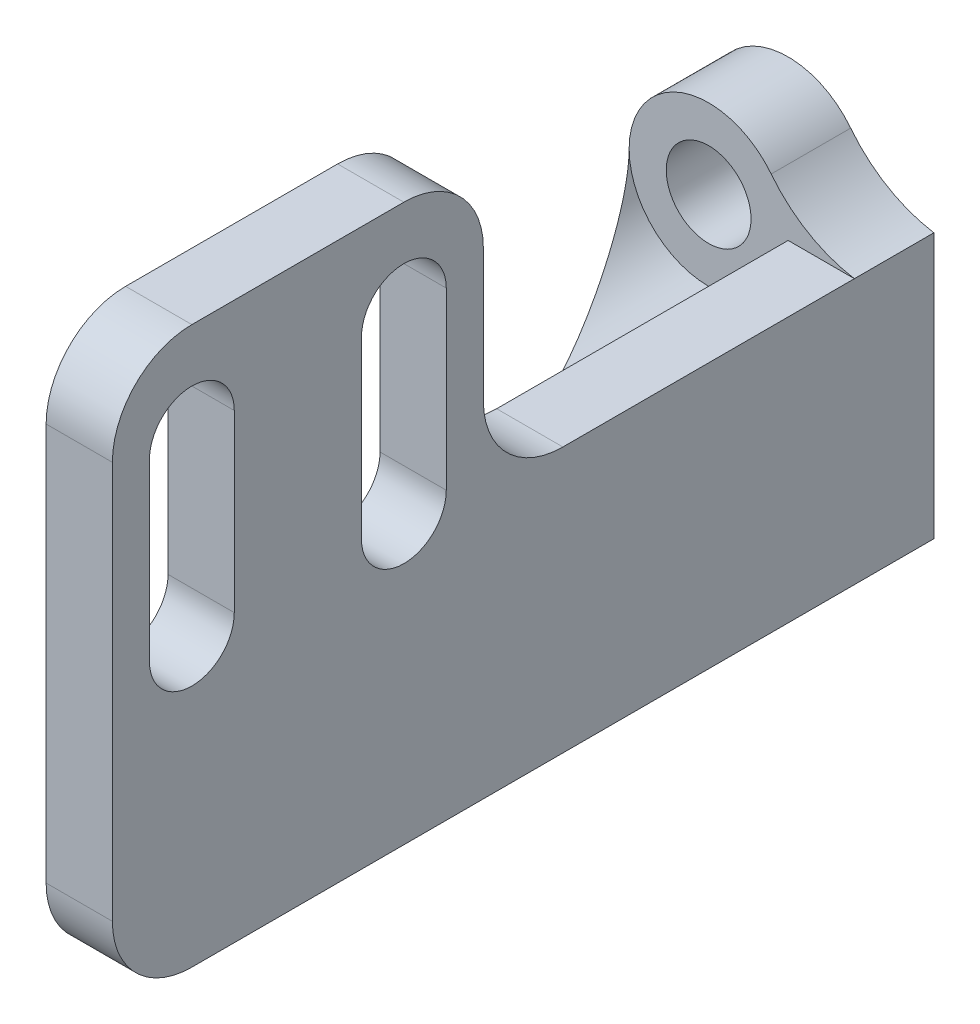
ISO-10303-21;
HEADER;
FILE_DESCRIPTION(('STEP AP214'),'2;1');
FILE_NAME('part.step','',(''),(''),'','','');
FILE_SCHEMA(('AUTOMOTIVE_DESIGN { 1 0 10303 214 1 1 1 1 }'));
ENDSEC;
DATA;
#1=APPLICATION_CONTEXT('core data for automotive mechanical design processes');
#2=APPLICATION_PROTOCOL_DEFINITION('international standard','automotive_design',2000,#1);
#3=PRODUCT_CONTEXT('',#1,'mechanical');
#4=PRODUCT('Part','Part','',(#3));
#5=PRODUCT_RELATED_PRODUCT_CATEGORY('part','',(#4));
#6=PRODUCT_DEFINITION_FORMATION('','',#4);
#7=PRODUCT_DEFINITION_CONTEXT('part definition',#1,'design');
#8=PRODUCT_DEFINITION('design','',#6,#7);
#9=PRODUCT_DEFINITION_SHAPE('','',#8);
#10=(LENGTH_UNIT() NAMED_UNIT(*) SI_UNIT(.MILLI.,.METRE.));
#11=(NAMED_UNIT(*) PLANE_ANGLE_UNIT() SI_UNIT($,.RADIAN.));
#12=(NAMED_UNIT(*) SI_UNIT($,.STERADIAN.) SOLID_ANGLE_UNIT());
#13=UNCERTAINTY_MEASURE_WITH_UNIT(LENGTH_MEASURE(1.E-05),#10,'distance_accuracy_value','');
#14=(GEOMETRIC_REPRESENTATION_CONTEXT(3) GLOBAL_UNCERTAINTY_ASSIGNED_CONTEXT((#13)) GLOBAL_UNIT_ASSIGNED_CONTEXT((#10,
#11,#12)) REPRESENTATION_CONTEXT('',''));
#15=CARTESIAN_POINT('',(0.,0.,0.));
#16=DIRECTION('',(0.,0.,1.));
#17=DIRECTION('',(1.,0.,0.));
#18=AXIS2_PLACEMENT_3D('',#15,#16,#17);
#19=CARTESIAN_POINT('',(3.00000000000005,-33.0103407456897,3.));
#20=DIRECTION('',(0.,1.,0.));
#21=DIRECTION('',(0.,0.,1.));
#22=AXIS2_PLACEMENT_3D('',#19,#20,#21);
#23=PLANE('',#22);
#24=DIRECTION('',(0.,0.,-1.));
#25=VECTOR('',#24,1.);
#26=CARTESIAN_POINT('',(3.00000000000004,-33.0103407456897,31.));
#27=LINE('',#26,#25);
#28=CARTESIAN_POINT('',(3.00000000000004,-33.0103407456897,3.));
#29=VERTEX_POINT('',#28);
#30=CARTESIAN_POINT('',(3.00000000000004,-33.0103407456897,14.));
#31=VERTEX_POINT('',#30);
#32=EDGE_CURVE('E236',#29,#31,#27,.F.);
#33=ORIENTED_EDGE('',*,*,#32,.T.);
#34=DIRECTION('',(1.,0.,0.));
#35=VECTOR('',#34,1.);
#36=CARTESIAN_POINT('',(5.50000000000005,-33.0103407456897,14.));
#37=LINE('',#36,#35);
#38=CARTESIAN_POINT('',(5.50000000000005,-33.0103407456897,14.));
#39=VERTEX_POINT('',#38);
#40=EDGE_CURVE('E307',#31,#39,#37,.T.);
#41=ORIENTED_EDGE('',*,*,#40,.T.);
#42=DIRECTION('',(0.,0.,-1.));
#43=VECTOR('',#42,1.);
#44=CARTESIAN_POINT('',(5.50000000000005,-33.0103407456897,3.));
#45=LINE('',#44,#43);
#46=CARTESIAN_POINT('',(5.50000000000005,-33.0103407456897,3.));
#47=VERTEX_POINT('',#46);
#48=EDGE_CURVE('E261',#39,#47,#45,.T.);
#49=ORIENTED_EDGE('',*,*,#48,.T.);
#50=DIRECTION('',(-1.,0.,0.));
#51=VECTOR('',#50,1.);
#52=CARTESIAN_POINT('',(0.,-33.0103407456897,3.));
#53=LINE('',#52,#51);
#54=EDGE_CURVE('E254',#47,#29,#53,.T.);
#55=ORIENTED_EDGE('',*,*,#54,.T.);
#56=EDGE_LOOP('',(#33,#41,#49,#55));
#57=FACE_BOUND('',#56,.T.);
#58=ADVANCED_FACE('F65',(#57),#23,.T.);
#59=CARTESIAN_POINT('',(5.50000000000005,-43.0103407456897,3.));
#60=DIRECTION('',(0.,-1.,0.));
#61=DIRECTION('',(0.,0.,-1.));
#62=AXIS2_PLACEMENT_3D('',#59,#60,#61);
#63=PLANE('',#62);
#64=DIRECTION('',(0.,0.,-1.));
#65=VECTOR('',#64,1.);
#66=CARTESIAN_POINT('',(5.50000000000005,-43.0103407456897,3.));
#67=LINE('',#66,#65);
#68=CARTESIAN_POINT('',(5.50000000000005,-43.0103407456897,28.));
#69=VERTEX_POINT('',#68);
#70=CARTESIAN_POINT('',(5.50000000000005,-43.0103407456897,3.));
#71=VERTEX_POINT('',#70);
#72=EDGE_CURVE('E395',#69,#71,#67,.T.);
#73=ORIENTED_EDGE('',*,*,#72,.F.);
#74=DIRECTION('',(1.,0.,0.));
#75=VECTOR('',#74,1.);
#76=CARTESIAN_POINT('',(5.50000000000005,-43.0103407456897,28.));
#77=LINE('',#76,#75);
#78=CARTESIAN_POINT('',(3.00000000000005,-43.0103407456897,28.));
#79=VERTEX_POINT('',#78);
#80=EDGE_CURVE('E300',#69,#79,#77,.F.);
#81=ORIENTED_EDGE('',*,*,#80,.T.);
#82=DIRECTION('',(0.,0.,-1.));
#83=VECTOR('',#82,1.);
#84=CARTESIAN_POINT('',(3.00000000000005,-43.0103407456897,31.));
#85=LINE('',#84,#83);
#86=CARTESIAN_POINT('',(3.00000000000005,-43.0103407456897,14.));
#87=VERTEX_POINT('',#86);
#88=EDGE_CURVE('E353',#79,#87,#85,.T.);
#89=ORIENTED_EDGE('',*,*,#88,.T.);
#90=DIRECTION('',(0.,0.,-1.));
#91=VECTOR('',#90,1.);
#92=CARTESIAN_POINT('',(3.00000000000005,-43.0103407456897,31.));
#93=LINE('',#92,#91);
#94=CARTESIAN_POINT('',(3.00000000000005,-43.0103407456897,3.));
#95=VERTEX_POINT('',#94);
#96=EDGE_CURVE('E246',#87,#95,#93,.T.);
#97=ORIENTED_EDGE('',*,*,#96,.T.);
#98=DIRECTION('',(1.,0.,0.));
#99=VECTOR('',#98,1.);
#100=CARTESIAN_POINT('',(0.,-43.0103407456897,3.));
#101=LINE('',#100,#99);
#102=EDGE_CURVE('E389',#95,#71,#101,.T.);
#103=ORIENTED_EDGE('',*,*,#102,.T.);
#104=EDGE_LOOP('',(#73,#81,#89,#97,#103));
#105=FACE_BOUND('',#104,.T.);
#106=ADVANCED_FACE('F451',(#105),#63,.T.);
#107=CARTESIAN_POINT('',(3.00000000000005,-20.480376659548,14.));
#108=DIRECTION('',(-0.877895572914384,0.,0.478852130680573));
#109=DIRECTION('',(0.478852130680573,0.,0.877895572914384));
#110=AXIS2_PLACEMENT_3D('',#107,#108,#109);
#111=PLANE('',#110);
#112=DIRECTION('',(0.,-1.,0.));
#113=VECTOR('',#112,1.);
#114=CARTESIAN_POINT('',(-2.99999999999995,0.,3.));
#115=LINE('',#114,#113);
#116=CARTESIAN_POINT('',(-2.99999999999995,-33.0103407456897,3.));
#117=VERTEX_POINT('',#116);
#118=CARTESIAN_POINT('',(-2.99999999999995,-43.0103407456897,3.));
#119=VERTEX_POINT('',#118);
#120=EDGE_CURVE('E356',#117,#119,#115,.T.);
#121=ORIENTED_EDGE('',*,*,#120,.T.);
#122=CARTESIAN_POINT('',(0.,-43.0103407456897,8.5));
#123=DIRECTION('',(-0.877895572914384,0.,0.478852130680573));
#124=DIRECTION('',(-0.478852130680573,0.,-0.877895572914384));
#125=AXIS2_PLACEMENT_3D('',#122,#123,#124);
#126=ELLIPSE('',#125,6.26498204307084,3.);
#127=EDGE_CURVE('E291',#119,#87,#126,.F.);
#128=ORIENTED_EDGE('',*,*,#127,.T.);
#129=DIRECTION('',(0.,-1.,0.));
#130=VECTOR('',#129,1.);
#131=CARTESIAN_POINT('',(3.00000000000005,-20.480376659548,14.));
#132=LINE('',#131,#130);
#133=EDGE_CURVE('E339',#31,#87,#132,.T.);
#134=ORIENTED_EDGE('',*,*,#133,.F.);
#135=CARTESIAN_POINT('',(0.,-33.0103407456897,8.5));
#136=DIRECTION('',(-0.877895572914384,0.,0.478852130680573));
#137=DIRECTION('',(-0.478852130680573,0.,-0.877895572914384));
#138=AXIS2_PLACEMENT_3D('',#135,#136,#137);
#139=ELLIPSE('',#138,6.26498204307082,2.99999999999999);
#140=EDGE_CURVE('E241',#31,#117,#139,.F.);
#141=ORIENTED_EDGE('',*,*,#140,.T.);
#142=EDGE_LOOP('',(#121,#128,#134,#141));
#143=FACE_BOUND('',#142,.T.);
#144=ADVANCED_FACE('F435',(#143),#111,.T.);
#145=CARTESIAN_POINT('',(0.,0.,3.));
#146=DIRECTION('',(0.,0.,1.));
#147=DIRECTION('',(1.,0.,0.));
#148=AXIS2_PLACEMENT_3D('',#145,#146,#147);
#149=PLANE('',#148);
#150=CARTESIAN_POINT('',(0.,-43.0103407456897,3.));
#151=DIRECTION('',(0.,0.,1.));
#152=DIRECTION('',(1.,0.,0.));
#153=AXIS2_PLACEMENT_3D('',#150,#151,#152);
#154=CIRCLE('',#153,3.);
#155=CARTESIAN_POINT('',(2.3607954545455,-44.8614606288408,3.));
#156=VERTEX_POINT('',#155);
#157=EDGE_CURVE('E359',#119,#156,#154,.T.);
#158=ORIENTED_EDGE('',*,*,#157,.T.);
#159=CARTESIAN_POINT('',(6.29545454545459,-47.9466604340928,3.));
#160=DIRECTION('',(0.,0.,1.));
#161=DIRECTION('',(1.,0.,0.));
#162=AXIS2_PLACEMENT_3D('',#159,#160,#161);
#163=CIRCLE('',#162,5.);
#164=EDGE_CURVE('E268',#156,#71,#163,.F.);
#165=ORIENTED_EDGE('',*,*,#164,.T.);
#166=ORIENTED_EDGE('',*,*,#102,.F.);
#167=CARTESIAN_POINT('',(0.,-43.0103407456897,3.));
#168=DIRECTION('',(0.,0.,1.));
#169=DIRECTION('',(1.,0.,0.));
#170=AXIS2_PLACEMENT_3D('',#167,#168,#169);
#171=CIRCLE('',#170,3.);
#172=EDGE_CURVE('E247',#95,#119,#171,.T.);
#173=ORIENTED_EDGE('',*,*,#172,.T.);
#174=EDGE_LOOP('',(#158,#165,#166,#173));
#175=FACE_BOUND('',#174,.T.);
#176=CARTESIAN_POINT('',(0.,-43.0103407456897,3.));
#177=DIRECTION('',(0.,0.,1.));
#178=DIRECTION('',(1.,0.,0.));
#179=AXIS2_PLACEMENT_3D('',#176,#177,#178);
#180=CIRCLE('',#179,1.6);
#181=CARTESIAN_POINT('',(1.60000000000005,-43.0103407456897,3.));
#182=VERTEX_POINT('',#181);
#183=EDGE_CURVE('E367',#182,#182,#180,.T.);
#184=ORIENTED_EDGE('',*,*,#183,.F.);
#185=EDGE_LOOP('',(#184));
#186=FACE_BOUND('',#185,.T.);
#187=ADVANCED_FACE('F407',(#175,#186),#149,.T.);
#188=CARTESIAN_POINT('',(0.,-43.0103407456897,3.));
#189=DIRECTION('',(0.,0.,-1.));
#190=DIRECTION('',(-1.,0.,0.));
#191=AXIS2_PLACEMENT_3D('',#188,#189,#190);
#192=CYLINDRICAL_SURFACE('',#191,1.6);
#193=ORIENTED_EDGE('',*,*,#183,.T.);
#194=EDGE_LOOP('',(#193));
#195=FACE_BOUND('',#194,.T.);
#196=CARTESIAN_POINT('',(0.,-43.0103407456897,0.));
#197=DIRECTION('',(0.,0.,1.));
#198=DIRECTION('',(1.,0.,0.));
#199=AXIS2_PLACEMENT_3D('',#196,#197,#198);
#200=CIRCLE('',#199,1.6);
#201=CARTESIAN_POINT('',(1.60000000000005,-43.0103407456897,0.));
#202=VERTEX_POINT('',#201);
#203=EDGE_CURVE('E360',#202,#202,#200,.T.);
#204=ORIENTED_EDGE('',*,*,#203,.F.);
#205=EDGE_LOOP('',(#204));
#206=FACE_BOUND('',#205,.T.);
#207=ADVANCED_FACE('F446',(#195,#206),#192,.F.);
#208=CARTESIAN_POINT('',(0.,-33.0103407456897,3.));
#209=DIRECTION('',(0.,0.,-1.));
#210=DIRECTION('',(-1.,0.,0.));
#211=AXIS2_PLACEMENT_3D('',#208,#209,#210);
#212=CYLINDRICAL_SURFACE('',#211,1.6);
#213=CARTESIAN_POINT('',(0.,-33.0103407456897,3.));
#214=DIRECTION('',(0.,0.,1.));
#215=DIRECTION('',(1.,0.,0.));
#216=AXIS2_PLACEMENT_3D('',#213,#214,#215);
#217=CIRCLE('',#216,1.6);
#218=CARTESIAN_POINT('',(1.60000000000005,-33.0103407456897,3.));
#219=VERTEX_POINT('',#218);
#220=EDGE_CURVE('E364',#219,#219,#217,.T.);
#221=ORIENTED_EDGE('',*,*,#220,.T.);
#222=EDGE_LOOP('',(#221));
#223=FACE_BOUND('',#222,.T.);
#224=CARTESIAN_POINT('',(0.,-33.0103407456897,0.));
#225=DIRECTION('',(0.,0.,1.));
#226=DIRECTION('',(1.,0.,0.));
#227=AXIS2_PLACEMENT_3D('',#224,#225,#226);
#228=CIRCLE('',#227,1.6);
#229=CARTESIAN_POINT('',(1.60000000000005,-33.0103407456897,0.));
#230=VERTEX_POINT('',#229);
#231=EDGE_CURVE('E379',#230,#230,#228,.T.);
#232=ORIENTED_EDGE('',*,*,#231,.F.);
#233=EDGE_LOOP('',(#232));
#234=FACE_BOUND('',#233,.T.);
#235=ADVANCED_FACE('F439',(#223,#234),#212,.F.);
#236=CARTESIAN_POINT('',(0.,-43.0103407456897,3.));
#237=DIRECTION('',(0.,0.,-1.));
#238=DIRECTION('',(-1.,0.,0.));
#239=AXIS2_PLACEMENT_3D('',#236,#237,#238);
#240=CYLINDRICAL_SURFACE('',#239,3.);
#241=CARTESIAN_POINT('',(0.,-43.0103407456897,0.));
#242=DIRECTION('',(0.,0.,1.));
#243=DIRECTION('',(1.,0.,0.));
#244=AXIS2_PLACEMENT_3D('',#241,#242,#243);
#245=CIRCLE('',#244,3.);
#246=CARTESIAN_POINT('',(-2.99999999999995,-43.0103407456897,0.));
#247=VERTEX_POINT('',#246);
#248=CARTESIAN_POINT('',(2.3607954545455,-44.8614606288408,0.));
#249=VERTEX_POINT('',#248);
#250=EDGE_CURVE('E374',#247,#249,#245,.T.);
#251=ORIENTED_EDGE('',*,*,#250,.T.);
#252=DIRECTION('',(0.,0.,-1.));
#253=VECTOR('',#252,1.);
#254=CARTESIAN_POINT('',(2.3607954545455,-44.8614606288408,3.));
#255=LINE('',#254,#253);
#256=EDGE_CURVE('E399',#249,#156,#255,.F.);
#257=ORIENTED_EDGE('',*,*,#256,.T.);
#258=ORIENTED_EDGE('',*,*,#157,.F.);
#259=DIRECTION('',(0.,0.,-1.));
#260=VECTOR('',#259,1.);
#261=CARTESIAN_POINT('',(-2.99999999999995,-43.0103407456897,3.));
#262=LINE('',#261,#260);
#263=EDGE_CURVE('E386',#119,#247,#262,.T.);
#264=ORIENTED_EDGE('',*,*,#263,.T.);
#265=EDGE_LOOP('',(#251,#257,#258,#264));
#266=FACE_BOUND('',#265,.T.);
#267=ADVANCED_FACE('F437',(#266),#240,.T.);
#268=CARTESIAN_POINT('',(0.,-33.0103407456897,3.));
#269=DIRECTION('',(0.,0.,-1.));
#270=DIRECTION('',(-1.,0.,0.));
#271=AXIS2_PLACEMENT_3D('',#268,#269,#270);
#272=CYLINDRICAL_SURFACE('',#271,3.);
#273=CARTESIAN_POINT('',(0.,-33.0103407456897,3.));
#274=DIRECTION('',(0.,0.,1.));
#275=DIRECTION('',(1.,0.,0.));
#276=AXIS2_PLACEMENT_3D('',#273,#274,#275);
#277=CIRCLE('',#276,3.);
#278=CARTESIAN_POINT('',(2.3607954545455,-31.1592208625386,3.));
#279=VERTEX_POINT('',#278);
#280=EDGE_CURVE('E257',#279,#117,#277,.T.);
#281=ORIENTED_EDGE('',*,*,#280,.F.);
#282=DIRECTION('',(0.,0.,-1.));
#283=VECTOR('',#282,1.);
#284=CARTESIAN_POINT('',(2.3607954545455,-31.1592208625386,3.));
#285=LINE('',#284,#283);
#286=CARTESIAN_POINT('',(2.3607954545455,-31.1592208625386,0.));
#287=VERTEX_POINT('',#286);
#288=EDGE_CURVE('E263',#279,#287,#285,.T.);
#289=ORIENTED_EDGE('',*,*,#288,.T.);
#290=CARTESIAN_POINT('',(0.,-33.0103407456897,0.));
#291=DIRECTION('',(0.,0.,1.));
#292=DIRECTION('',(1.,0.,0.));
#293=AXIS2_PLACEMENT_3D('',#290,#291,#292);
#294=CIRCLE('',#293,3.);
#295=CARTESIAN_POINT('',(-2.99999999999995,-33.0103407456897,0.));
#296=VERTEX_POINT('',#295);
#297=EDGE_CURVE('E377',#287,#296,#294,.T.);
#298=ORIENTED_EDGE('',*,*,#297,.T.);
#299=DIRECTION('',(0.,0.,-1.));
#300=VECTOR('',#299,1.);
#301=CARTESIAN_POINT('',(-2.99999999999995,-33.0103407456897,3.));
#302=LINE('',#301,#300);
#303=EDGE_CURVE('E370',#117,#296,#302,.T.);
#304=ORIENTED_EDGE('',*,*,#303,.F.);
#305=EDGE_LOOP('',(#281,#289,#298,#304));
#306=FACE_BOUND('',#305,.T.);
#307=ADVANCED_FACE('F428',(#306),#272,.T.);
#308=CARTESIAN_POINT('',(-2.99999999999995,0.,3.));
#309=DIRECTION('',(1.,0.,0.));
#310=DIRECTION('',(0.,0.,-1.));
#311=AXIS2_PLACEMENT_3D('',#308,#309,#310);
#312=PLANE('',#311);
#313=DIRECTION('',(0.,-1.,0.));
#314=VECTOR('',#313,1.);
#315=CARTESIAN_POINT('',(-2.99999999999995,0.,0.));
#316=LINE('',#315,#314);
#317=EDGE_CURVE('E371',#296,#247,#316,.T.);
#318=ORIENTED_EDGE('',*,*,#317,.T.);
#319=ORIENTED_EDGE('',*,*,#263,.F.);
#320=ORIENTED_EDGE('',*,*,#120,.F.);
#321=ORIENTED_EDGE('',*,*,#303,.T.);
#322=EDGE_LOOP('',(#318,#319,#320,#321));
#323=FACE_BOUND('',#322,.T.);
#324=ADVANCED_FACE('F432',(#323),#312,.F.);
#325=CARTESIAN_POINT('',(0.,0.,0.));
#326=DIRECTION('',(0.,0.,1.));
#327=DIRECTION('',(1.,0.,0.));
#328=AXIS2_PLACEMENT_3D('',#325,#326,#327);
#329=PLANE('',#328);
#330=ORIENTED_EDGE('',*,*,#317,.F.);
#331=ORIENTED_EDGE('',*,*,#297,.F.);
#332=CARTESIAN_POINT('',(6.29545454545459,-28.0740210572866,0.));
#333=DIRECTION('',(0.,0.,1.));
#334=DIRECTION('',(1.,0.,0.));
#335=AXIS2_PLACEMENT_3D('',#332,#333,#334);
#336=CIRCLE('',#335,5.);
#337=CARTESIAN_POINT('',(5.50000000000005,-33.0103407456897,0.));
#338=VERTEX_POINT('',#337);
#339=EDGE_CURVE('E262',#287,#338,#336,.T.);
#340=ORIENTED_EDGE('',*,*,#339,.T.);
#341=DIRECTION('',(0.,-1.,0.));
#342=VECTOR('',#341,1.);
#343=CARTESIAN_POINT('',(5.50000000000005,-33.0103407456897,0.));
#344=LINE('',#343,#342);
#345=CARTESIAN_POINT('',(5.50000000000005,-43.0103407456897,0.));
#346=VERTEX_POINT('',#345);
#347=EDGE_CURVE('E355',#338,#346,#344,.T.);
#348=ORIENTED_EDGE('',*,*,#347,.T.);
#349=CARTESIAN_POINT('',(6.29545454545459,-47.9466604340928,0.));
#350=DIRECTION('',(0.,0.,1.));
#351=DIRECTION('',(1.,0.,0.));
#352=AXIS2_PLACEMENT_3D('',#349,#350,#351);
#353=CIRCLE('',#352,5.);
#354=EDGE_CURVE('E401',#346,#249,#353,.T.);
#355=ORIENTED_EDGE('',*,*,#354,.T.);
#356=ORIENTED_EDGE('',*,*,#250,.F.);
#357=EDGE_LOOP('',(#330,#331,#340,#348,#355,#356));
#358=FACE_BOUND('',#357,.T.);
#359=ORIENTED_EDGE('',*,*,#231,.T.);
#360=EDGE_LOOP('',(#359));
#361=FACE_BOUND('',#360,.T.);
#362=ORIENTED_EDGE('',*,*,#203,.T.);
#363=EDGE_LOOP('',(#362));
#364=FACE_BOUND('',#363,.T.);
#365=ADVANCED_FACE('F420',(#358,#361,#364),#329,.F.);
#366=CARTESIAN_POINT('',(6.29545454545459,-28.0740210572866,3.));
#367=DIRECTION('',(0.,0.,1.));
#368=DIRECTION('',(1.,0.,0.));
#369=AXIS2_PLACEMENT_3D('',#366,#367,#368);
#370=CIRCLE('',#369,5.);
#371=EDGE_CURVE('E265',#47,#279,#370,.F.);
#372=ORIENTED_EDGE('',*,*,#371,.T.);
#373=ORIENTED_EDGE('',*,*,#280,.T.);
#374=CARTESIAN_POINT('',(0.,-33.0103407456897,3.));
#375=DIRECTION('',(0.,0.,1.));
#376=DIRECTION('',(1.,0.,0.));
#377=AXIS2_PLACEMENT_3D('',#374,#375,#376);
#378=CIRCLE('',#377,2.99999999999999);
#379=EDGE_CURVE('E239',#117,#29,#378,.T.);
#380=ORIENTED_EDGE('',*,*,#379,.T.);
#381=ORIENTED_EDGE('',*,*,#54,.F.);
#382=EDGE_LOOP('',(#372,#373,#380,#381));
#383=FACE_BOUND('',#382,.T.);
#384=ORIENTED_EDGE('',*,*,#220,.F.);
#385=EDGE_LOOP('',(#384));
#386=FACE_BOUND('',#385,.T.);
#387=ADVANCED_FACE('F252',(#383,#386),#149,.T.);
#388=CARTESIAN_POINT('',(5.50000000000005,-33.0103407456897,3.));
#389=DIRECTION('',(1.,0.,0.));
#390=DIRECTION('',(0.,0.,-1.));
#391=AXIS2_PLACEMENT_3D('',#388,#389,#390);
#392=PLANE('',#391);
#393=CARTESIAN_POINT('',(5.50000000000005,-25.6179185229941,28.));
#394=DIRECTION('',(1.,0.,0.));
#395=DIRECTION('',(0.,0.,-1.));
#396=AXIS2_PLACEMENT_3D('',#393,#394,#395);
#397=CIRCLE('',#396,1.6);
#398=CARTESIAN_POINT('',(5.50000000000005,-25.6179185229941,26.4));
#399=VERTEX_POINT('',#398);
#400=CARTESIAN_POINT('',(5.50000000000005,-25.6179185229941,29.6));
#401=VERTEX_POINT('',#400);
#402=EDGE_CURVE('E496',#399,#401,#397,.T.);
#403=ORIENTED_EDGE('',*,*,#402,.F.);
#404=DIRECTION('',(0.,1.,0.));
#405=VECTOR('',#404,1.);
#406=CARTESIAN_POINT('',(5.50000000000005,-25.6179185229941,26.4));
#407=LINE('',#406,#405);
#408=CARTESIAN_POINT('',(5.50000000000005,-32.2232424042106,26.4));
#409=VERTEX_POINT('',#408);
#410=EDGE_CURVE('E505',#409,#399,#407,.T.);
#411=ORIENTED_EDGE('',*,*,#410,.F.);
#412=CARTESIAN_POINT('',(5.50000000000005,-32.2232424042106,28.));
#413=DIRECTION('',(1.,0.,0.));
#414=DIRECTION('',(0.,0.,-1.));
#415=AXIS2_PLACEMENT_3D('',#412,#413,#414);
#416=CIRCLE('',#415,1.59999999999999);
#417=CARTESIAN_POINT('',(5.50000000000005,-32.2232424042106,29.6));
#418=VERTEX_POINT('',#417);
#419=EDGE_CURVE('E502',#418,#409,#416,.T.);
#420=ORIENTED_EDGE('',*,*,#419,.F.);
#421=DIRECTION('',(0.,-1.,0.));
#422=VECTOR('',#421,1.);
#423=CARTESIAN_POINT('',(5.50000000000005,-25.6179185229941,29.6));
#424=LINE('',#423,#422);
#425=EDGE_CURVE('E498',#401,#418,#424,.T.);
#426=ORIENTED_EDGE('',*,*,#425,.F.);
#427=EDGE_LOOP('',(#403,#411,#420,#426));
#428=FACE_BOUND('',#427,.T.);
#429=CARTESIAN_POINT('',(5.50000000000005,-25.6179185229941,20.));
#430=DIRECTION('',(1.,0.,0.));
#431=DIRECTION('',(0.,0.,1.));
#432=AXIS2_PLACEMENT_3D('',#429,#430,#431);
#433=CIRCLE('',#432,1.6);
#434=CARTESIAN_POINT('',(5.50000000000005,-25.6179185229941,18.4));
#435=VERTEX_POINT('',#434);
#436=CARTESIAN_POINT('',(5.50000000000005,-25.6179185229941,21.6));
#437=VERTEX_POINT('',#436);
#438=EDGE_CURVE('E499',#435,#437,#433,.T.);
#439=ORIENTED_EDGE('',*,*,#438,.F.);
#440=DIRECTION('',(0.,1.,0.));
#441=VECTOR('',#440,1.);
#442=CARTESIAN_POINT('',(5.50000000000005,-25.6179185229941,18.4));
#443=LINE('',#442,#441);
#444=CARTESIAN_POINT('',(5.50000000000005,-32.2232424042106,18.4));
#445=VERTEX_POINT('',#444);
#446=EDGE_CURVE('E519',#445,#435,#443,.T.);
#447=ORIENTED_EDGE('',*,*,#446,.F.);
#448=CARTESIAN_POINT('',(5.50000000000005,-32.2232424042106,20.));
#449=DIRECTION('',(1.,0.,0.));
#450=DIRECTION('',(0.,0.,1.));
#451=AXIS2_PLACEMENT_3D('',#448,#449,#450);
#452=CIRCLE('',#451,1.59999999999999);
#453=CARTESIAN_POINT('',(5.50000000000005,-32.2232424042106,21.6));
#454=VERTEX_POINT('',#453);
#455=EDGE_CURVE('E527',#454,#445,#452,.T.);
#456=ORIENTED_EDGE('',*,*,#455,.F.);
#457=DIRECTION('',(0.,-1.,0.));
#458=VECTOR('',#457,1.);
#459=CARTESIAN_POINT('',(5.50000000000005,-25.6179185229941,21.6));
#460=LINE('',#459,#458);
#461=EDGE_CURVE('E530',#437,#454,#460,.T.);
#462=ORIENTED_EDGE('',*,*,#461,.F.);
#463=EDGE_LOOP('',(#439,#447,#456,#462));
#464=FACE_BOUND('',#463,.T.);
#465=DIRECTION('',(0.,1.,0.));
#466=VECTOR('',#465,1.);
#467=CARTESIAN_POINT('',(5.50000000000005,-43.0103407456897,31.));
#468=LINE('',#467,#466);
#469=CARTESIAN_POINT('',(5.50000000000005,-40.0103407456897,31.));
#470=VERTEX_POINT('',#469);
#471=CARTESIAN_POINT('',(5.50000000000005,-25.0103407456897,31.));
#472=VERTEX_POINT('',#471);
#473=EDGE_CURVE('E346',#470,#472,#468,.T.);
#474=ORIENTED_EDGE('',*,*,#473,.F.);
#475=CARTESIAN_POINT('',(5.50000000000005,-40.0103407456897,28.));
#476=DIRECTION('',(1.,0.,0.));
#477=DIRECTION('',(0.,0.,-1.));
#478=AXIS2_PLACEMENT_3D('',#475,#476,#477);
#479=CIRCLE('',#478,3.);
#480=EDGE_CURVE('E298',#470,#69,#479,.T.);
#481=ORIENTED_EDGE('',*,*,#480,.T.);
#482=ORIENTED_EDGE('',*,*,#72,.T.);
#483=EDGE_CURVE('E392',#71,#346,#67,.T.);
#484=ORIENTED_EDGE('',*,*,#483,.T.);
#485=ORIENTED_EDGE('',*,*,#347,.F.);
#486=EDGE_CURVE('E394',#47,#338,#45,.T.);
#487=ORIENTED_EDGE('',*,*,#486,.F.);
#488=ORIENTED_EDGE('',*,*,#48,.F.);
#489=CARTESIAN_POINT('',(5.50000000000005,-30.0103407456897,14.));
#490=DIRECTION('',(1.,0.,0.));
#491=DIRECTION('',(0.,0.,-1.));
#492=AXIS2_PLACEMENT_3D('',#489,#490,#491);
#493=CIRCLE('',#492,3.);
#494=CARTESIAN_POINT('',(5.50000000000005,-30.0103407456897,17.));
#495=VERTEX_POINT('',#494);
#496=EDGE_CURVE('E73',#39,#495,#493,.F.);
#497=ORIENTED_EDGE('',*,*,#496,.T.);
#498=DIRECTION('',(0.,1.,0.));
#499=VECTOR('',#498,1.);
#500=CARTESIAN_POINT('',(5.50000000000005,-22.0103407456897,17.));
#501=LINE('',#500,#499);
#502=CARTESIAN_POINT('',(5.50000000000005,-25.0103407456897,17.));
#503=VERTEX_POINT('',#502);
#504=EDGE_CURVE('E322',#495,#503,#501,.T.);
#505=ORIENTED_EDGE('',*,*,#504,.T.);
#506=CARTESIAN_POINT('',(5.50000000000005,-25.0103407456897,20.));
#507=DIRECTION('',(1.,0.,0.));
#508=DIRECTION('',(0.,0.,-1.));
#509=AXIS2_PLACEMENT_3D('',#506,#507,#508);
#510=CIRCLE('',#509,3.);
#511=CARTESIAN_POINT('',(5.50000000000005,-22.0103407456897,20.));
#512=VERTEX_POINT('',#511);
#513=EDGE_CURVE('E294',#503,#512,#510,.T.);
#514=ORIENTED_EDGE('',*,*,#513,.T.);
#515=DIRECTION('',(0.,0.,1.));
#516=VECTOR('',#515,1.);
#517=CARTESIAN_POINT('',(5.50000000000005,-22.0103407456897,31.));
#518=LINE('',#517,#516);
#519=CARTESIAN_POINT('',(5.50000000000005,-22.0103407456897,28.));
#520=VERTEX_POINT('',#519);
#521=EDGE_CURVE('E331',#512,#520,#518,.T.);
#522=ORIENTED_EDGE('',*,*,#521,.T.);
#523=CARTESIAN_POINT('',(5.50000000000005,-25.0103407456897,28.));
#524=DIRECTION('',(1.,0.,0.));
#525=DIRECTION('',(0.,0.,-1.));
#526=AXIS2_PLACEMENT_3D('',#523,#524,#525);
#527=CIRCLE('',#526,3.);
#528=EDGE_CURVE('E296',#520,#472,#527,.T.);
#529=ORIENTED_EDGE('',*,*,#528,.T.);
#530=EDGE_LOOP('',(#474,#481,#482,#484,#485,#487,#488,#497,#505,#514,#522,#529));
#531=FACE_BOUND('',#530,.T.);
#532=ADVANCED_FACE('F321',(#428,#464,#531),#392,.T.);
#533=CARTESIAN_POINT('',(3.00000000000005,-33.0103407456897,31.));
#534=DIRECTION('',(1.,0.,0.));
#535=DIRECTION('',(0.,0.,-1.));
#536=AXIS2_PLACEMENT_3D('',#533,#534,#535);
#537=PLANE('',#536);
#538=CARTESIAN_POINT('',(3.00000000000005,-33.0103407456897,21.3930097633688));
#539=CARTESIAN_POINT('',(3.00000000000005,-33.1951352528028,21.2885945224365));
#540=CARTESIAN_POINT('',(3.00000000000005,-33.3467062679307,21.1392229575088));
#541=CARTESIAN_POINT('',(3.00000000000005,-33.497692865432,20.9904273297111));
#542=CARTESIAN_POINT('',(3.00000000000005,-33.605153643467,20.8064250286398));
#543=CARTESIAN_POINT('',(3.00000000000005,-33.7120596777578,20.6233726008833));
#544=CARTESIAN_POINT('',(3.00000000000005,-33.767758183154,20.4176972690776));
#545=CARTESIAN_POINT('',(3.00000000000005,-33.8231691566887,20.2130836930693));
#546=CARTESIAN_POINT('',(3.00000000000005,-33.8232424042106,20.));
#547=CARTESIAN_POINT('',(3.00000000000005,-33.8233152736075,19.7880163068444));
#548=CARTESIAN_POINT('',(3.00000000000005,-33.767758183154,19.5823027309225));
#549=CARTESIAN_POINT('',(3.00000000000005,-33.7124878945393,19.3776511082337));
#550=CARTESIAN_POINT('',(3.00000000000005,-33.605153643467,19.1935749713602));
#551=CARTESIAN_POINT('',(3.00000000000005,-33.4983734829765,19.0104490889743));
#552=CARTESIAN_POINT('',(3.00000000000005,-33.3467062679307,18.8607770424912));
#553=CARTESIAN_POINT('',(3.00000000000005,-33.1956225498546,18.7116808171278));
#554=CARTESIAN_POINT('',(3.00000000000005,-33.0103407456897,18.6069902366312));
#555=B_SPLINE_CURVE_WITH_KNOTS('',2,(#538,#539,#540,#541,#542,#543,#544,#545,#546,#547,#548,
#549,#550,#551,#552,#553,#554),.UNSPECIFIED.,.F.,.F.,(3,2,2,2,2,2,2,2,3),(0.,0.125,0.25,0.375,
0.5,0.625,0.75,0.875,1.),.UNSPECIFIED.);
#556=CARTESIAN_POINT('',(3.00000000000005,-33.0103407456897,21.3930097633688));
#557=VERTEX_POINT('',#556);
#558=CARTESIAN_POINT('',(3.00000000000005,-33.0103407456897,18.6069902366312));
#559=VERTEX_POINT('',#558);
#560=EDGE_CURVE('E287',#557,#559,#555,.T.);
#561=ORIENTED_EDGE('',*,*,#560,.T.);
#562=CARTESIAN_POINT('',(3.00000000000005,-32.2232424042106,20.));
#563=DIRECTION('',(1.,0.,0.));
#564=DIRECTION('',(0.,0.,-1.));
#565=AXIS2_PLACEMENT_3D('',#562,#563,#564);
#566=CIRCLE('',#565,1.59999999999999);
#567=CARTESIAN_POINT('',(3.00000000000005,-32.2232424042106,18.4));
#568=VERTEX_POINT('',#567);
#569=EDGE_CURVE('E276',#559,#568,#566,.T.);
#570=ORIENTED_EDGE('',*,*,#569,.T.);
#571=DIRECTION('',(0.,1.,0.));
#572=VECTOR('',#571,1.);
#573=CARTESIAN_POINT('',(3.00000000000005,-33.0103407456897,18.4));
#574=LINE('',#573,#572);
#575=CARTESIAN_POINT('',(3.00000000000005,-25.6179185229941,18.4));
#576=VERTEX_POINT('',#575);
#577=EDGE_CURVE('E279',#568,#576,#574,.T.);
#578=ORIENTED_EDGE('',*,*,#577,.T.);
#579=CARTESIAN_POINT('',(3.00000000000005,-25.6179185229941,20.));
#580=DIRECTION('',(1.,0.,0.));
#581=DIRECTION('',(0.,0.,-1.));
#582=AXIS2_PLACEMENT_3D('',#579,#580,#581);
#583=CIRCLE('',#582,1.6);
#584=CARTESIAN_POINT('',(3.00000000000005,-25.6179185229941,21.6));
#585=VERTEX_POINT('',#584);
#586=EDGE_CURVE('E555',#576,#585,#583,.T.);
#587=ORIENTED_EDGE('',*,*,#586,.T.);
#588=DIRECTION('',(0.,-1.,0.));
#589=VECTOR('',#588,1.);
#590=CARTESIAN_POINT('',(3.00000000000005,-33.0103407456897,21.6));
#591=LINE('',#590,#589);
#592=CARTESIAN_POINT('',(3.00000000000005,-32.2232424042106,21.6));
#593=VERTEX_POINT('',#592);
#594=EDGE_CURVE('E273',#585,#593,#591,.T.);
#595=ORIENTED_EDGE('',*,*,#594,.T.);
#596=EDGE_CURVE('E283',#593,#557,#566,.T.);
#597=ORIENTED_EDGE('',*,*,#596,.T.);
#598=EDGE_LOOP('',(#561,#570,#578,#587,#595,#597));
#599=FACE_BOUND('',#598,.T.);
#600=CARTESIAN_POINT('',(3.00000000000005,-33.0103407456897,29.3930097633688));
#601=CARTESIAN_POINT('',(3.00000000000005,-33.1951352528012,29.2885945224374));
#602=CARTESIAN_POINT('',(3.00000000000005,-33.3467062679307,29.1392229575088));
#603=CARTESIAN_POINT('',(3.00000000000005,-33.4976928654301,28.9904273297136));
#604=CARTESIAN_POINT('',(3.00000000000005,-33.605153643467,28.8064250286398));
#605=CARTESIAN_POINT('',(3.00000000000005,-33.7120596777575,28.6233726008845));
#606=CARTESIAN_POINT('',(3.00000000000005,-33.767758183154,28.4176972690775));
#607=CARTESIAN_POINT('',(3.00000000000005,-33.8231691566887,28.2130836930693));
#608=CARTESIAN_POINT('',(3.00000000000005,-33.8232424042106,28.));
#609=CARTESIAN_POINT('',(3.00000000000005,-33.8233152736075,27.7880163068444));
#610=CARTESIAN_POINT('',(3.00000000000005,-33.767758183154,27.5823027309224));
#611=CARTESIAN_POINT('',(3.00000000000005,-33.7124878945381,27.3776511082294));
#612=CARTESIAN_POINT('',(3.00000000000005,-33.605153643467,27.1935749713602));
#613=CARTESIAN_POINT('',(3.00000000000005,-33.4983734829734,27.0104490889712));
#614=CARTESIAN_POINT('',(3.00000000000005,-33.3467062679307,26.8607770424912));
#615=CARTESIAN_POINT('',(3.00000000000005,-33.1956225498546,26.7116808171278));
#616=CARTESIAN_POINT('',(3.00000000000005,-33.0103407456897,26.6069902366312));
#617=B_SPLINE_CURVE_WITH_KNOTS('',2,(#600,#601,#602,#603,#604,#605,#606,#607,#608,#609,#610,
#611,#612,#613,#614,#615,#616),.UNSPECIFIED.,.F.,.F.,(3,2,2,2,2,2,2,2,3),(0.,0.125,0.25,0.375,
0.5,0.625,0.75,0.875,1.),.UNSPECIFIED.);
#618=CARTESIAN_POINT('',(3.00000000000005,-33.0103407456897,29.3930097633688));
#619=VERTEX_POINT('',#618);
#620=CARTESIAN_POINT('',(3.00000000000005,-33.0103407456897,26.6069902366312));
#621=VERTEX_POINT('',#620);
#622=EDGE_CURVE('E572',#619,#621,#617,.T.);
#623=ORIENTED_EDGE('',*,*,#622,.T.);
#624=CARTESIAN_POINT('',(3.00000000000005,-32.2232424042106,28.));
#625=DIRECTION('',(1.,0.,0.));
#626=DIRECTION('',(0.,0.,-1.));
#627=AXIS2_PLACEMENT_3D('',#624,#625,#626);
#628=CIRCLE('',#627,1.59999999999999);
#629=CARTESIAN_POINT('',(3.00000000000005,-32.2232424042106,26.4));
#630=VERTEX_POINT('',#629);
#631=EDGE_CURVE('E559',#621,#630,#628,.T.);
#632=ORIENTED_EDGE('',*,*,#631,.T.);
#633=DIRECTION('',(0.,1.,0.));
#634=VECTOR('',#633,1.);
#635=CARTESIAN_POINT('',(3.00000000000005,-33.0103407456897,26.4));
#636=LINE('',#635,#634);
#637=CARTESIAN_POINT('',(3.00000000000005,-25.6179185229941,26.4));
#638=VERTEX_POINT('',#637);
#639=EDGE_CURVE('E564',#630,#638,#636,.T.);
#640=ORIENTED_EDGE('',*,*,#639,.T.);
#641=CARTESIAN_POINT('',(3.00000000000005,-25.6179185229941,28.));
#642=DIRECTION('',(1.,0.,0.));
#643=DIRECTION('',(0.,0.,-1.));
#644=AXIS2_PLACEMENT_3D('',#641,#642,#643);
#645=CIRCLE('',#644,1.6);
#646=CARTESIAN_POINT('',(3.00000000000005,-25.6179185229941,29.6));
#647=VERTEX_POINT('',#646);
#648=EDGE_CURVE('E897',#638,#647,#645,.T.);
#649=ORIENTED_EDGE('',*,*,#648,.T.);
#650=DIRECTION('',(0.,-1.,0.));
#651=VECTOR('',#650,1.);
#652=CARTESIAN_POINT('',(3.00000000000005,-33.0103407456897,29.6));
#653=LINE('',#652,#651);
#654=CARTESIAN_POINT('',(3.00000000000005,-32.2232424042106,29.6));
#655=VERTEX_POINT('',#654);
#656=EDGE_CURVE('E557',#647,#655,#653,.T.);
#657=ORIENTED_EDGE('',*,*,#656,.T.);
#658=EDGE_CURVE('E568',#655,#619,#628,.T.);
#659=ORIENTED_EDGE('',*,*,#658,.T.);
#660=EDGE_LOOP('',(#623,#632,#640,#649,#657,#659));
#661=FACE_BOUND('',#660,.T.);
#662=ORIENTED_EDGE('',*,*,#88,.F.);
#663=CARTESIAN_POINT('',(3.00000000000005,-40.0103407456897,28.));
#664=DIRECTION('',(1.,0.,0.));
#665=DIRECTION('',(0.,0.,-1.));
#666=AXIS2_PLACEMENT_3D('',#663,#664,#665);
#667=CIRCLE('',#666,3.);
#668=CARTESIAN_POINT('',(3.00000000000005,-40.0103407456897,31.));
#669=VERTEX_POINT('',#668);
#670=EDGE_CURVE('E305',#79,#669,#667,.F.);
#671=ORIENTED_EDGE('',*,*,#670,.T.);
#672=DIRECTION('',(0.,-1.,0.));
#673=VECTOR('',#672,1.);
#674=CARTESIAN_POINT('',(3.00000000000005,-33.0103407456897,31.));
#675=LINE('',#674,#673);
#676=CARTESIAN_POINT('',(3.00000000000005,-25.0103407456897,31.));
#677=VERTEX_POINT('',#676);
#678=EDGE_CURVE('E342',#677,#669,#675,.T.);
#679=ORIENTED_EDGE('',*,*,#678,.F.);
#680=CARTESIAN_POINT('',(3.00000000000005,-25.0103407456897,28.));
#681=DIRECTION('',(1.,0.,0.));
#682=DIRECTION('',(0.,0.,-1.));
#683=AXIS2_PLACEMENT_3D('',#680,#681,#682);
#684=CIRCLE('',#683,3.);
#685=CARTESIAN_POINT('',(3.00000000000005,-22.0103407456897,28.));
#686=VERTEX_POINT('',#685);
#687=EDGE_CURVE('E87',#677,#686,#684,.F.);
#688=ORIENTED_EDGE('',*,*,#687,.T.);
#689=DIRECTION('',(0.,0.,-1.));
#690=VECTOR('',#689,1.);
#691=CARTESIAN_POINT('',(3.00000000000005,-22.0103407456897,31.));
#692=LINE('',#691,#690);
#693=CARTESIAN_POINT('',(3.00000000000005,-22.0103407456897,20.));
#694=VERTEX_POINT('',#693);
#695=EDGE_CURVE('E343',#686,#694,#692,.T.);
#696=ORIENTED_EDGE('',*,*,#695,.T.);
#697=CARTESIAN_POINT('',(3.00000000000005,-25.0103407456897,20.));
#698=DIRECTION('',(1.,0.,0.));
#699=DIRECTION('',(0.,0.,-1.));
#700=AXIS2_PLACEMENT_3D('',#697,#698,#699);
#701=CIRCLE('',#700,3.);
#702=CARTESIAN_POINT('',(3.00000000000005,-25.0103407456897,17.));
#703=VERTEX_POINT('',#702);
#704=EDGE_CURVE('E302',#694,#703,#701,.F.);
#705=ORIENTED_EDGE('',*,*,#704,.T.);
#706=DIRECTION('',(0.,-1.,0.));
#707=VECTOR('',#706,1.);
#708=CARTESIAN_POINT('',(3.00000000000005,-22.0103407456897,17.));
#709=LINE('',#708,#707);
#710=CARTESIAN_POINT('',(3.00000000000005,-30.0103407456897,17.));
#711=VERTEX_POINT('',#710);
#712=EDGE_CURVE('E340',#703,#711,#709,.T.);
#713=ORIENTED_EDGE('',*,*,#712,.T.);
#714=CARTESIAN_POINT('',(3.00000000000005,-30.0103407456897,14.));
#715=DIRECTION('',(1.,0.,0.));
#716=DIRECTION('',(0.,0.,-1.));
#717=AXIS2_PLACEMENT_3D('',#714,#715,#716);
#718=CIRCLE('',#717,3.);
#719=EDGE_CURVE('E12',#711,#31,#718,.T.);
#720=ORIENTED_EDGE('',*,*,#719,.T.);
#721=ORIENTED_EDGE('',*,*,#133,.T.);
#722=EDGE_LOOP('',(#662,#671,#679,#688,#696,#705,#713,#720,#721));
#723=FACE_BOUND('',#722,.T.);
#724=ADVANCED_FACE('F338',(#599,#661,#723),#537,.F.);
#725=CARTESIAN_POINT('',(0.,0.,31.));
#726=DIRECTION('',(0.,0.,1.));
#727=DIRECTION('',(1.,0.,0.));
#728=AXIS2_PLACEMENT_3D('',#725,#726,#727);
#729=PLANE('',#728);
#730=ORIENTED_EDGE('',*,*,#678,.T.);
#731=DIRECTION('',(1.,0.,0.));
#732=VECTOR('',#731,1.);
#733=CARTESIAN_POINT('',(0.,-40.0103407456897,31.));
#734=LINE('',#733,#732);
#735=EDGE_CURVE('E290',#669,#470,#734,.T.);
#736=ORIENTED_EDGE('',*,*,#735,.T.);
#737=ORIENTED_EDGE('',*,*,#473,.T.);
#738=DIRECTION('',(1.,0.,0.));
#739=VECTOR('',#738,1.);
#740=CARTESIAN_POINT('',(0.,-25.0103407456897,31.));
#741=LINE('',#740,#739);
#742=EDGE_CURVE('E288',#472,#677,#741,.F.);
#743=ORIENTED_EDGE('',*,*,#742,.T.);
#744=EDGE_LOOP('',(#730,#736,#737,#743));
#745=FACE_BOUND('',#744,.T.);
#746=ADVANCED_FACE('F465',(#745),#729,.T.);
#747=CARTESIAN_POINT('',(6.29545454545459,-47.9466604340928,3.));
#748=DIRECTION('',(0.,0.,1.));
#749=DIRECTION('',(1.,0.,0.));
#750=AXIS2_PLACEMENT_3D('',#747,#748,#749);
#751=CYLINDRICAL_SURFACE('',#750,5.);
#752=ORIENTED_EDGE('',*,*,#164,.F.);
#753=ORIENTED_EDGE('',*,*,#256,.F.);
#754=ORIENTED_EDGE('',*,*,#354,.F.);
#755=ORIENTED_EDGE('',*,*,#483,.F.);
#756=EDGE_LOOP('',(#752,#753,#754,#755));
#757=FACE_BOUND('',#756,.T.);
#758=ADVANCED_FACE('F414',(#757),#751,.F.);
#759=CARTESIAN_POINT('',(6.29545454545459,-28.0740210572866,3.));
#760=DIRECTION('',(0.,0.,1.));
#761=DIRECTION('',(1.,0.,0.));
#762=AXIS2_PLACEMENT_3D('',#759,#760,#761);
#763=CYLINDRICAL_SURFACE('',#762,5.);
#764=ORIENTED_EDGE('',*,*,#371,.F.);
#765=ORIENTED_EDGE('',*,*,#486,.T.);
#766=ORIENTED_EDGE('',*,*,#339,.F.);
#767=ORIENTED_EDGE('',*,*,#288,.F.);
#768=EDGE_LOOP('',(#764,#765,#766,#767));
#769=FACE_BOUND('',#768,.T.);
#770=ADVANCED_FACE('F426',(#769),#763,.F.);
#771=CARTESIAN_POINT('',(-14.8044938147648,-22.0103407456897,31.));
#772=DIRECTION('',(0.,1.,0.));
#773=DIRECTION('',(0.,0.,1.));
#774=AXIS2_PLACEMENT_3D('',#771,#772,#773);
#775=PLANE('',#774);
#776=ORIENTED_EDGE('',*,*,#695,.F.);
#777=DIRECTION('',(1.,0.,0.));
#778=VECTOR('',#777,1.);
#779=CARTESIAN_POINT('',(-14.8044938147648,-22.0103407456897,28.));
#780=LINE('',#779,#778);
#781=EDGE_CURVE('E315',#686,#520,#780,.T.);
#782=ORIENTED_EDGE('',*,*,#781,.T.);
#783=ORIENTED_EDGE('',*,*,#521,.F.);
#784=DIRECTION('',(1.,0.,0.));
#785=VECTOR('',#784,1.);
#786=CARTESIAN_POINT('',(-14.8044938147648,-22.0103407456897,20.));
#787=LINE('',#786,#785);
#788=EDGE_CURVE('E80',#512,#694,#787,.F.);
#789=ORIENTED_EDGE('',*,*,#788,.T.);
#790=EDGE_LOOP('',(#776,#782,#783,#789));
#791=FACE_BOUND('',#790,.T.);
#792=ADVANCED_FACE('F468',(#791),#775,.T.);
#793=CARTESIAN_POINT('',(-14.8044938147648,-22.0103407456897,17.));
#794=DIRECTION('',(0.,0.,-1.));
#795=DIRECTION('',(-1.,0.,0.));
#796=AXIS2_PLACEMENT_3D('',#793,#794,#795);
#797=PLANE('',#796);
#798=ORIENTED_EDGE('',*,*,#504,.F.);
#799=DIRECTION('',(1.,0.,0.));
#800=VECTOR('',#799,1.);
#801=CARTESIAN_POINT('',(3.00000000000005,-30.0103407456897,17.));
#802=LINE('',#801,#800);
#803=EDGE_CURVE('E312',#495,#711,#802,.F.);
#804=ORIENTED_EDGE('',*,*,#803,.T.);
#805=ORIENTED_EDGE('',*,*,#712,.F.);
#806=DIRECTION('',(1.,0.,0.));
#807=VECTOR('',#806,1.);
#808=CARTESIAN_POINT('',(-14.8044938147648,-25.0103407456897,17.));
#809=LINE('',#808,#807);
#810=EDGE_CURVE('E309',#703,#503,#809,.T.);
#811=ORIENTED_EDGE('',*,*,#810,.T.);
#812=EDGE_LOOP('',(#798,#804,#805,#811));
#813=FACE_BOUND('',#812,.T.);
#814=ADVANCED_FACE('F327',(#813),#797,.T.);
#815=CARTESIAN_POINT('',(-2.99999999999995,-25.6179185229941,20.));
#816=DIRECTION('',(1.,0.,0.));
#817=DIRECTION('',(0.,0.,-1.));
#818=AXIS2_PLACEMENT_3D('',#815,#816,#817);
#819=CYLINDRICAL_SURFACE('',#818,1.6);
#820=DIRECTION('',(1.,0.,0.));
#821=VECTOR('',#820,1.);
#822=CARTESIAN_POINT('',(-2.99999999999995,-25.6179185229941,18.4));
#823=LINE('',#822,#821);
#824=EDGE_CURVE('E493',#576,#435,#823,.T.);
#825=ORIENTED_EDGE('',*,*,#824,.T.);
#826=ORIENTED_EDGE('',*,*,#438,.T.);
#827=DIRECTION('',(1.,0.,0.));
#828=VECTOR('',#827,1.);
#829=CARTESIAN_POINT('',(-2.99999999999995,-25.6179185229941,21.6));
#830=LINE('',#829,#828);
#831=EDGE_CURVE('E516',#585,#437,#830,.T.);
#832=ORIENTED_EDGE('',*,*,#831,.F.);
#833=ORIENTED_EDGE('',*,*,#586,.F.);
#834=EDGE_LOOP('',(#825,#826,#832,#833));
#835=FACE_BOUND('',#834,.T.);
#836=ADVANCED_FACE('F536',(#835),#819,.F.);
#837=CARTESIAN_POINT('',(-2.99999999999995,-25.6179185229941,18.4));
#838=DIRECTION('',(0.,0.,-1.));
#839=DIRECTION('',(0.,1.,0.));
#840=AXIS2_PLACEMENT_3D('',#837,#838,#839);
#841=PLANE('',#840);
#842=DIRECTION('',(1.,0.,0.));
#843=VECTOR('',#842,1.);
#844=CARTESIAN_POINT('',(-2.99999999999995,-32.2232424042106,18.4));
#845=LINE('',#844,#843);
#846=EDGE_CURVE('E522',#568,#445,#845,.T.);
#847=ORIENTED_EDGE('',*,*,#846,.T.);
#848=ORIENTED_EDGE('',*,*,#446,.T.);
#849=ORIENTED_EDGE('',*,*,#824,.F.);
#850=ORIENTED_EDGE('',*,*,#577,.F.);
#851=EDGE_LOOP('',(#847,#848,#849,#850));
#852=FACE_BOUND('',#851,.T.);
#853=ADVANCED_FACE('F629',(#852),#841,.F.);
#854=CARTESIAN_POINT('',(-2.99999999999995,-32.2232424042106,20.));
#855=DIRECTION('',(1.,0.,0.));
#856=DIRECTION('',(0.,0.,-1.));
#857=AXIS2_PLACEMENT_3D('',#854,#855,#856);
#858=CYLINDRICAL_SURFACE('',#857,1.59999999999999);
#859=DIRECTION('',(1.,0.,0.));
#860=VECTOR('',#859,1.);
#861=CARTESIAN_POINT('',(-2.99999999999995,-32.2232424042106,21.6));
#862=LINE('',#861,#860);
#863=EDGE_CURVE('E520',#593,#454,#862,.T.);
#864=ORIENTED_EDGE('',*,*,#863,.T.);
#865=ORIENTED_EDGE('',*,*,#455,.T.);
#866=ORIENTED_EDGE('',*,*,#846,.F.);
#867=ORIENTED_EDGE('',*,*,#569,.F.);
#868=ORIENTED_EDGE('',*,*,#560,.F.);
#869=ORIENTED_EDGE('',*,*,#596,.F.);
#870=EDGE_LOOP('',(#864,#865,#866,#867,#868,#869));
#871=FACE_BOUND('',#870,.T.);
#872=ADVANCED_FACE('F547',(#871),#858,.F.);
#873=CARTESIAN_POINT('',(-2.99999999999995,-25.6179185229941,21.6));
#874=DIRECTION('',(0.,0.,1.));
#875=DIRECTION('',(0.,-1.,0.));
#876=AXIS2_PLACEMENT_3D('',#873,#874,#875);
#877=PLANE('',#876);
#878=ORIENTED_EDGE('',*,*,#831,.T.);
#879=ORIENTED_EDGE('',*,*,#461,.T.);
#880=ORIENTED_EDGE('',*,*,#863,.F.);
#881=ORIENTED_EDGE('',*,*,#594,.F.);
#882=EDGE_LOOP('',(#878,#879,#880,#881));
#883=FACE_BOUND('',#882,.T.);
#884=ADVANCED_FACE('F543',(#883),#877,.F.);
#885=CARTESIAN_POINT('',(-2.99999999999995,-25.6179185229941,28.));
#886=DIRECTION('',(1.,0.,0.));
#887=DIRECTION('',(0.,0.,-1.));
#888=AXIS2_PLACEMENT_3D('',#885,#886,#887);
#889=CYLINDRICAL_SURFACE('',#888,1.6);
#890=DIRECTION('',(1.,0.,0.));
#891=VECTOR('',#890,1.);
#892=CARTESIAN_POINT('',(-2.99999999999995,-25.6179185229941,26.4));
#893=LINE('',#892,#891);
#894=EDGE_CURVE('E332',#638,#399,#893,.T.);
#895=ORIENTED_EDGE('',*,*,#894,.T.);
#896=ORIENTED_EDGE('',*,*,#402,.T.);
#897=DIRECTION('',(1.,0.,0.));
#898=VECTOR('',#897,1.);
#899=CARTESIAN_POINT('',(-2.99999999999995,-25.6179185229941,29.6));
#900=LINE('',#899,#898);
#901=EDGE_CURVE('E508',#647,#401,#900,.T.);
#902=ORIENTED_EDGE('',*,*,#901,.F.);
#903=ORIENTED_EDGE('',*,*,#648,.F.);
#904=EDGE_LOOP('',(#895,#896,#902,#903));
#905=FACE_BOUND('',#904,.T.);
#906=ADVANCED_FACE('F623',(#905),#889,.F.);
#907=CARTESIAN_POINT('',(-2.99999999999995,-25.6179185229941,26.4));
#908=DIRECTION('',(0.,0.,-1.));
#909=DIRECTION('',(0.,1.,0.));
#910=AXIS2_PLACEMENT_3D('',#907,#908,#909);
#911=PLANE('',#910);
#912=DIRECTION('',(1.,0.,0.));
#913=VECTOR('',#912,1.);
#914=CARTESIAN_POINT('',(-2.99999999999995,-32.2232424042106,26.4));
#915=LINE('',#914,#913);
#916=EDGE_CURVE('E510',#630,#409,#915,.T.);
#917=ORIENTED_EDGE('',*,*,#916,.T.);
#918=ORIENTED_EDGE('',*,*,#410,.T.);
#919=ORIENTED_EDGE('',*,*,#894,.F.);
#920=ORIENTED_EDGE('',*,*,#639,.F.);
#921=EDGE_LOOP('',(#917,#918,#919,#920));
#922=FACE_BOUND('',#921,.T.);
#923=ADVANCED_FACE('F618',(#922),#911,.F.);
#924=CARTESIAN_POINT('',(-2.99999999999995,-32.2232424042106,28.));
#925=DIRECTION('',(1.,0.,0.));
#926=DIRECTION('',(0.,0.,-1.));
#927=AXIS2_PLACEMENT_3D('',#924,#925,#926);
#928=CYLINDRICAL_SURFACE('',#927,1.59999999999999);
#929=DIRECTION('',(1.,0.,0.));
#930=VECTOR('',#929,1.);
#931=CARTESIAN_POINT('',(-2.99999999999995,-32.2232424042106,29.6));
#932=LINE('',#931,#930);
#933=EDGE_CURVE('E512',#655,#418,#932,.T.);
#934=ORIENTED_EDGE('',*,*,#933,.T.);
#935=ORIENTED_EDGE('',*,*,#419,.T.);
#936=ORIENTED_EDGE('',*,*,#916,.F.);
#937=ORIENTED_EDGE('',*,*,#631,.F.);
#938=ORIENTED_EDGE('',*,*,#622,.F.);
#939=ORIENTED_EDGE('',*,*,#658,.F.);
#940=EDGE_LOOP('',(#934,#935,#936,#937,#938,#939));
#941=FACE_BOUND('',#940,.T.);
#942=ADVANCED_FACE('F607',(#941),#928,.F.);
#943=CARTESIAN_POINT('',(-2.99999999999995,-25.6179185229941,29.6));
#944=DIRECTION('',(0.,0.,1.));
#945=DIRECTION('',(0.,-1.,0.));
#946=AXIS2_PLACEMENT_3D('',#943,#944,#945);
#947=PLANE('',#946);
#948=ORIENTED_EDGE('',*,*,#901,.T.);
#949=ORIENTED_EDGE('',*,*,#425,.T.);
#950=ORIENTED_EDGE('',*,*,#933,.F.);
#951=ORIENTED_EDGE('',*,*,#656,.F.);
#952=EDGE_LOOP('',(#948,#949,#950,#951));
#953=FACE_BOUND('',#952,.T.);
#954=ADVANCED_FACE('F617',(#953),#947,.F.);
#955=CARTESIAN_POINT('',(0.,-33.0103407456897,31.));
#956=DIRECTION('',(0.,0.,-1.));
#957=DIRECTION('',(-1.,0.,0.));
#958=AXIS2_PLACEMENT_3D('',#955,#956,#957);
#959=CYLINDRICAL_SURFACE('',#958,2.99999999999999);
#960=ORIENTED_EDGE('',*,*,#379,.F.);
#961=ORIENTED_EDGE('',*,*,#140,.F.);
#962=ORIENTED_EDGE('',*,*,#32,.F.);
#963=EDGE_LOOP('',(#960,#961,#962));
#964=FACE_BOUND('',#963,.T.);
#965=ADVANCED_FACE('F238',(#964),#959,.F.);
#966=CARTESIAN_POINT('',(0.,-43.0103407456897,31.));
#967=DIRECTION('',(0.,0.,-1.));
#968=DIRECTION('',(-1.,0.,0.));
#969=AXIS2_PLACEMENT_3D('',#966,#967,#968);
#970=CYLINDRICAL_SURFACE('',#969,3.);
#971=ORIENTED_EDGE('',*,*,#127,.F.);
#972=ORIENTED_EDGE('',*,*,#172,.F.);
#973=ORIENTED_EDGE('',*,*,#96,.F.);
#974=EDGE_LOOP('',(#971,#972,#973));
#975=FACE_BOUND('',#974,.T.);
#976=ADVANCED_FACE('F472',(#975),#970,.F.);
#977=CARTESIAN_POINT('',(0.,-40.0103407456897,28.));
#978=DIRECTION('',(1.,0.,0.));
#979=DIRECTION('',(0.,0.,-1.));
#980=AXIS2_PLACEMENT_3D('',#977,#978,#979);
#981=CYLINDRICAL_SURFACE('',#980,3.);
#982=ORIENTED_EDGE('',*,*,#670,.F.);
#983=ORIENTED_EDGE('',*,*,#80,.F.);
#984=ORIENTED_EDGE('',*,*,#480,.F.);
#985=ORIENTED_EDGE('',*,*,#735,.F.);
#986=EDGE_LOOP('',(#982,#983,#984,#985));
#987=FACE_BOUND('',#986,.T.);
#988=ADVANCED_FACE('F469',(#987),#981,.T.);
#989=CARTESIAN_POINT('',(3.00000000000005,-30.0103407456897,14.));
#990=DIRECTION('',(-1.,0.,0.));
#991=DIRECTION('',(0.,0.,1.));
#992=AXIS2_PLACEMENT_3D('',#989,#990,#991);
#993=CYLINDRICAL_SURFACE('',#992,3.);
#994=ORIENTED_EDGE('',*,*,#719,.F.);
#995=ORIENTED_EDGE('',*,*,#803,.F.);
#996=ORIENTED_EDGE('',*,*,#496,.F.);
#997=ORIENTED_EDGE('',*,*,#40,.F.);
#998=EDGE_LOOP('',(#994,#995,#996,#997));
#999=FACE_BOUND('',#998,.T.);
#1000=ADVANCED_FACE('F335',(#999),#993,.F.);
#1001=CARTESIAN_POINT('',(-14.8044938147648,-25.0103407456897,28.));
#1002=DIRECTION('',(1.,0.,0.));
#1003=DIRECTION('',(0.,0.,-1.));
#1004=AXIS2_PLACEMENT_3D('',#1001,#1002,#1003);
#1005=CYLINDRICAL_SURFACE('',#1004,3.);
#1006=ORIENTED_EDGE('',*,*,#687,.F.);
#1007=ORIENTED_EDGE('',*,*,#742,.F.);
#1008=ORIENTED_EDGE('',*,*,#528,.F.);
#1009=ORIENTED_EDGE('',*,*,#781,.F.);
#1010=EDGE_LOOP('',(#1006,#1007,#1008,#1009));
#1011=FACE_BOUND('',#1010,.T.);
#1012=ADVANCED_FACE('F475',(#1011),#1005,.T.);
#1013=CARTESIAN_POINT('',(-14.8044938147648,-25.0103407456897,20.));
#1014=DIRECTION('',(1.,0.,0.));
#1015=DIRECTION('',(0.,0.,-1.));
#1016=AXIS2_PLACEMENT_3D('',#1013,#1014,#1015);
#1017=CYLINDRICAL_SURFACE('',#1016,3.);
#1018=ORIENTED_EDGE('',*,*,#704,.F.);
#1019=ORIENTED_EDGE('',*,*,#788,.F.);
#1020=ORIENTED_EDGE('',*,*,#513,.F.);
#1021=ORIENTED_EDGE('',*,*,#810,.F.);
#1022=EDGE_LOOP('',(#1018,#1019,#1020,#1021));
#1023=FACE_BOUND('',#1022,.T.);
#1024=ADVANCED_FACE('F67',(#1023),#1017,.T.);
#1025=CLOSED_SHELL('',(#58,#106,#144,#187,#207,#235,#267,#307,#324,#365,#387,#532,#724,#746,
#758,#770,#792,#814,#836,#853,#872,#884,#906,#923,#942,#954,#965,#976,#988,#1000,#1012,#1024));
#1026=MANIFOLD_SOLID_BREP('B2',#1025);
#1027=ADVANCED_BREP_SHAPE_REPRESENTATION('',(#18,#1026),#14);
#1028=SHAPE_DEFINITION_REPRESENTATION(#9,#1027);
ENDSEC;
END-ISO-10303-21;
